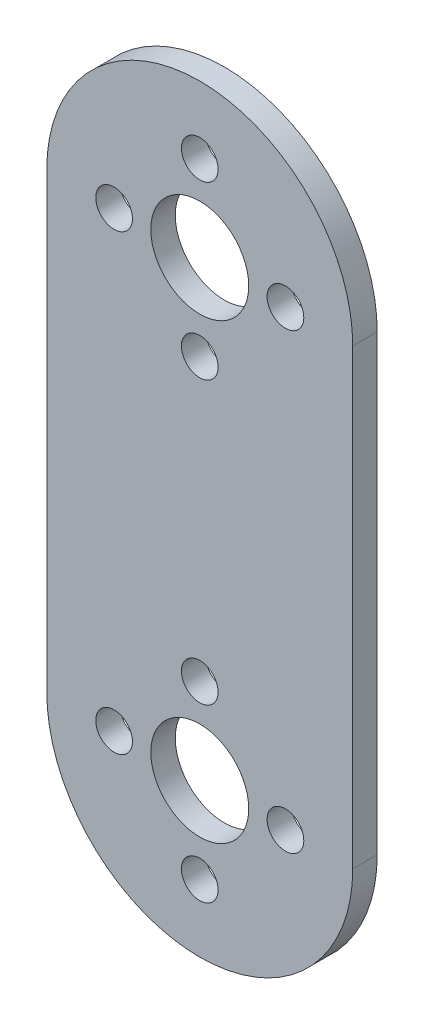
ISO-10303-21;
HEADER;
FILE_DESCRIPTION(('STEP AP214'),'2;1');
FILE_NAME('part.step','',(''),(''),'','','');
FILE_SCHEMA(('AUTOMOTIVE_DESIGN { 1 0 10303 214 1 1 1 1 }'));
ENDSEC;
DATA;
#1=APPLICATION_CONTEXT('core data for automotive mechanical design processes');
#2=APPLICATION_PROTOCOL_DEFINITION('international standard','automotive_design',2000,#1);
#3=PRODUCT_CONTEXT('',#1,'mechanical');
#4=PRODUCT('Part','Part','',(#3));
#5=PRODUCT_RELATED_PRODUCT_CATEGORY('part','',(#4));
#6=PRODUCT_DEFINITION_FORMATION('','',#4);
#7=PRODUCT_DEFINITION_CONTEXT('part definition',#1,'design');
#8=PRODUCT_DEFINITION('design','',#6,#7);
#9=PRODUCT_DEFINITION_SHAPE('','',#8);
#10=(LENGTH_UNIT() NAMED_UNIT(*) SI_UNIT(.MILLI.,.METRE.));
#11=(NAMED_UNIT(*) PLANE_ANGLE_UNIT() SI_UNIT($,.RADIAN.));
#12=(NAMED_UNIT(*) SI_UNIT($,.STERADIAN.) SOLID_ANGLE_UNIT());
#13=UNCERTAINTY_MEASURE_WITH_UNIT(LENGTH_MEASURE(1.E-05),#10,'distance_accuracy_value','');
#14=(GEOMETRIC_REPRESENTATION_CONTEXT(3) GLOBAL_UNCERTAINTY_ASSIGNED_CONTEXT((#13)) GLOBAL_UNIT_ASSIGNED_CONTEXT((#10,
#11,#12)) REPRESENTATION_CONTEXT('',''));
#15=CARTESIAN_POINT('',(0.,0.,0.));
#16=DIRECTION('',(0.,0.,1.));
#17=DIRECTION('',(1.,0.,0.));
#18=AXIS2_PLACEMENT_3D('',#15,#16,#17);
#19=CARTESIAN_POINT('',(0.,0.,1.));
#20=DIRECTION('',(0.,0.,-1.));
#21=DIRECTION('',(-1.,0.,0.));
#22=AXIS2_PLACEMENT_3D('',#19,#20,#21);
#23=CYLINDRICAL_SURFACE('',#22,12.5);
#24=CARTESIAN_POINT('',(0.,0.,-1.));
#25=DIRECTION('',(0.,0.,1.));
#26=DIRECTION('',(1.,0.,0.));
#27=AXIS2_PLACEMENT_3D('',#24,#25,#26);
#28=CIRCLE('',#27,12.5);
#29=CARTESIAN_POINT('',(-12.5,0.,-1.));
#30=VERTEX_POINT('',#29);
#31=CARTESIAN_POINT('',(12.5,0.,-1.));
#32=VERTEX_POINT('',#31);
#33=EDGE_CURVE('E110',#30,#32,#28,.T.);
#34=ORIENTED_EDGE('',*,*,#33,.T.);
#35=DIRECTION('',(0.,0.,-1.));
#36=VECTOR('',#35,1.);
#37=CARTESIAN_POINT('',(12.5,0.,1.));
#38=LINE('',#37,#36);
#39=CARTESIAN_POINT('',(12.5,0.,1.));
#40=VERTEX_POINT('',#39);
#41=EDGE_CURVE('E11',#40,#32,#38,.T.);
#42=ORIENTED_EDGE('',*,*,#41,.F.);
#43=CARTESIAN_POINT('',(0.,0.,1.));
#44=DIRECTION('',(0.,0.,1.));
#45=DIRECTION('',(1.,0.,0.));
#46=AXIS2_PLACEMENT_3D('',#43,#44,#45);
#47=CIRCLE('',#46,12.5);
#48=CARTESIAN_POINT('',(-12.5,0.,1.));
#49=VERTEX_POINT('',#48);
#50=EDGE_CURVE('E94',#49,#40,#47,.T.);
#51=ORIENTED_EDGE('',*,*,#50,.F.);
#52=DIRECTION('',(0.,0.,-1.));
#53=VECTOR('',#52,1.);
#54=CARTESIAN_POINT('',(-12.5,0.,1.));
#55=LINE('',#54,#53);
#56=EDGE_CURVE('E106',#49,#30,#55,.T.);
#57=ORIENTED_EDGE('',*,*,#56,.T.);
#58=EDGE_LOOP('',(#34,#42,#51,#57));
#59=FACE_BOUND('',#58,.T.);
#60=ADVANCED_FACE('F42',(#59),#23,.T.);
#61=CARTESIAN_POINT('',(12.5,0.,1.));
#62=DIRECTION('',(-1.,0.,0.));
#63=DIRECTION('',(0.,0.,1.));
#64=AXIS2_PLACEMENT_3D('',#61,#62,#63);
#65=PLANE('',#64);
#66=DIRECTION('',(0.,1.,0.));
#67=VECTOR('',#66,1.);
#68=CARTESIAN_POINT('',(12.5,0.,-1.));
#69=LINE('',#68,#67);
#70=CARTESIAN_POINT('',(12.5,37.,-1.));
#71=VERTEX_POINT('',#70);
#72=EDGE_CURVE('E99',#32,#71,#69,.T.);
#73=ORIENTED_EDGE('',*,*,#72,.T.);
#74=DIRECTION('',(0.,0.,-1.));
#75=VECTOR('',#74,1.);
#76=CARTESIAN_POINT('',(12.5,37.,1.));
#77=LINE('',#76,#75);
#78=CARTESIAN_POINT('',(12.5,37.,1.));
#79=VERTEX_POINT('',#78);
#80=EDGE_CURVE('E51',#79,#71,#77,.T.);
#81=ORIENTED_EDGE('',*,*,#80,.F.);
#82=DIRECTION('',(0.,1.,0.));
#83=VECTOR('',#82,1.);
#84=CARTESIAN_POINT('',(12.5,0.,1.));
#85=LINE('',#84,#83);
#86=EDGE_CURVE('E89',#40,#79,#85,.T.);
#87=ORIENTED_EDGE('',*,*,#86,.F.);
#88=ORIENTED_EDGE('',*,*,#41,.T.);
#89=EDGE_LOOP('',(#73,#81,#87,#88));
#90=FACE_BOUND('',#89,.T.);
#91=ADVANCED_FACE('F98',(#90),#65,.F.);
#92=CARTESIAN_POINT('',(0.,37.,1.));
#93=DIRECTION('',(0.,0.,-1.));
#94=DIRECTION('',(-1.,0.,0.));
#95=AXIS2_PLACEMENT_3D('',#92,#93,#94);
#96=CYLINDRICAL_SURFACE('',#95,12.5);
#97=CARTESIAN_POINT('',(0.,37.,-1.));
#98=DIRECTION('',(0.,0.,1.));
#99=DIRECTION('',(1.,0.,0.));
#100=AXIS2_PLACEMENT_3D('',#97,#98,#99);
#101=CIRCLE('',#100,12.5);
#102=CARTESIAN_POINT('',(-12.5,37.,-1.));
#103=VERTEX_POINT('',#102);
#104=EDGE_CURVE('E76',#71,#103,#101,.T.);
#105=ORIENTED_EDGE('',*,*,#104,.T.);
#106=DIRECTION('',(0.,0.,-1.));
#107=VECTOR('',#106,1.);
#108=CARTESIAN_POINT('',(-12.5,37.,1.));
#109=LINE('',#108,#107);
#110=CARTESIAN_POINT('',(-12.5,37.,1.));
#111=VERTEX_POINT('',#110);
#112=EDGE_CURVE('E101',#111,#103,#109,.T.);
#113=ORIENTED_EDGE('',*,*,#112,.F.);
#114=CARTESIAN_POINT('',(0.,37.,1.));
#115=DIRECTION('',(0.,0.,1.));
#116=DIRECTION('',(1.,0.,0.));
#117=AXIS2_PLACEMENT_3D('',#114,#115,#116);
#118=CIRCLE('',#117,12.5);
#119=EDGE_CURVE('E92',#79,#111,#118,.T.);
#120=ORIENTED_EDGE('',*,*,#119,.F.);
#121=ORIENTED_EDGE('',*,*,#80,.T.);
#122=EDGE_LOOP('',(#105,#113,#120,#121));
#123=FACE_BOUND('',#122,.T.);
#124=ADVANCED_FACE('F102',(#123),#96,.T.);
#125=CARTESIAN_POINT('',(-12.5,0.,1.));
#126=DIRECTION('',(1.,0.,0.));
#127=DIRECTION('',(0.,0.,-1.));
#128=AXIS2_PLACEMENT_3D('',#125,#126,#127);
#129=PLANE('',#128);
#130=DIRECTION('',(0.,-1.,0.));
#131=VECTOR('',#130,1.);
#132=CARTESIAN_POINT('',(-12.5,0.,-1.));
#133=LINE('',#132,#131);
#134=EDGE_CURVE('E82',#103,#30,#133,.T.);
#135=ORIENTED_EDGE('',*,*,#134,.T.);
#136=ORIENTED_EDGE('',*,*,#56,.F.);
#137=DIRECTION('',(0.,-1.,0.));
#138=VECTOR('',#137,1.);
#139=CARTESIAN_POINT('',(-12.5,0.,1.));
#140=LINE('',#139,#138);
#141=EDGE_CURVE('E59',#111,#49,#140,.T.);
#142=ORIENTED_EDGE('',*,*,#141,.F.);
#143=ORIENTED_EDGE('',*,*,#112,.T.);
#144=EDGE_LOOP('',(#135,#136,#142,#143));
#145=FACE_BOUND('',#144,.T.);
#146=ADVANCED_FACE('F124',(#145),#129,.F.);
#147=CARTESIAN_POINT('',(0.,0.,1.));
#148=DIRECTION('',(0.,0.,1.));
#149=DIRECTION('',(1.,0.,0.));
#150=AXIS2_PLACEMENT_3D('',#147,#148,#149);
#151=PLANE('',#150);
#152=CARTESIAN_POINT('',(7.,0.,1.));
#153=DIRECTION('',(0.,0.,1.));
#154=DIRECTION('',(1.,0.,0.));
#155=AXIS2_PLACEMENT_3D('',#152,#153,#154);
#156=CIRCLE('',#155,1.5);
#157=CARTESIAN_POINT('',(8.5,0.,1.));
#158=VERTEX_POINT('',#157);
#159=EDGE_CURVE('E186',#158,#158,#156,.T.);
#160=ORIENTED_EDGE('',*,*,#159,.F.);
#161=EDGE_LOOP('',(#160));
#162=FACE_BOUND('',#161,.T.);
#163=CARTESIAN_POINT('',(0.,7.,1.));
#164=DIRECTION('',(0.,0.,1.));
#165=DIRECTION('',(1.,0.,0.));
#166=AXIS2_PLACEMENT_3D('',#163,#164,#165);
#167=CIRCLE('',#166,1.5);
#168=CARTESIAN_POINT('',(1.5,7.,1.));
#169=VERTEX_POINT('',#168);
#170=EDGE_CURVE('E196',#169,#169,#167,.T.);
#171=ORIENTED_EDGE('',*,*,#170,.F.);
#172=EDGE_LOOP('',(#171));
#173=FACE_BOUND('',#172,.T.);
#174=CARTESIAN_POINT('',(-7.,0.,1.));
#175=DIRECTION('',(0.,0.,1.));
#176=DIRECTION('',(1.,0.,0.));
#177=AXIS2_PLACEMENT_3D('',#174,#175,#176);
#178=CIRCLE('',#177,1.5);
#179=CARTESIAN_POINT('',(-5.5,0.,1.));
#180=VERTEX_POINT('',#179);
#181=EDGE_CURVE('E187',#180,#180,#178,.T.);
#182=ORIENTED_EDGE('',*,*,#181,.F.);
#183=EDGE_LOOP('',(#182));
#184=FACE_BOUND('',#183,.T.);
#185=CARTESIAN_POINT('',(0.,-7.,1.));
#186=DIRECTION('',(0.,0.,1.));
#187=DIRECTION('',(1.,0.,0.));
#188=AXIS2_PLACEMENT_3D('',#185,#186,#187);
#189=CIRCLE('',#188,1.5);
#190=CARTESIAN_POINT('',(1.5,-7.,1.));
#191=VERTEX_POINT('',#190);
#192=EDGE_CURVE('E178',#191,#191,#189,.T.);
#193=ORIENTED_EDGE('',*,*,#192,.F.);
#194=EDGE_LOOP('',(#193));
#195=FACE_BOUND('',#194,.T.);
#196=CARTESIAN_POINT('',(0.,0.,1.));
#197=DIRECTION('',(0.,0.,1.));
#198=DIRECTION('',(1.,0.,0.));
#199=AXIS2_PLACEMENT_3D('',#196,#197,#198);
#200=CIRCLE('',#199,4.);
#201=CARTESIAN_POINT('',(4.,0.,1.));
#202=VERTEX_POINT('',#201);
#203=EDGE_CURVE('E152',#202,#202,#200,.T.);
#204=ORIENTED_EDGE('',*,*,#203,.F.);
#205=EDGE_LOOP('',(#204));
#206=FACE_BOUND('',#205,.T.);
#207=CARTESIAN_POINT('',(7.,37.,1.));
#208=DIRECTION('',(0.,0.,1.));
#209=DIRECTION('',(1.,0.,0.));
#210=AXIS2_PLACEMENT_3D('',#207,#208,#209);
#211=CIRCLE('',#210,1.5);
#212=CARTESIAN_POINT('',(8.5,37.,1.));
#213=VERTEX_POINT('',#212);
#214=EDGE_CURVE('E164',#213,#213,#211,.F.);
#215=ORIENTED_EDGE('',*,*,#214,.T.);
#216=EDGE_LOOP('',(#215));
#217=FACE_BOUND('',#216,.T.);
#218=CARTESIAN_POINT('',(0.,30.,1.));
#219=DIRECTION('',(0.,0.,1.));
#220=DIRECTION('',(1.,0.,0.));
#221=AXIS2_PLACEMENT_3D('',#218,#219,#220);
#222=CIRCLE('',#221,1.5);
#223=CARTESIAN_POINT('',(1.5,30.,1.));
#224=VERTEX_POINT('',#223);
#225=EDGE_CURVE('E156',#224,#224,#222,.F.);
#226=ORIENTED_EDGE('',*,*,#225,.T.);
#227=EDGE_LOOP('',(#226));
#228=FACE_BOUND('',#227,.T.);
#229=CARTESIAN_POINT('',(-7.,37.0000000000001,1.));
#230=DIRECTION('',(0.,0.,1.));
#231=DIRECTION('',(1.,0.,0.));
#232=AXIS2_PLACEMENT_3D('',#229,#230,#231);
#233=CIRCLE('',#232,1.5);
#234=CARTESIAN_POINT('',(-5.5,37.0000000000001,1.));
#235=VERTEX_POINT('',#234);
#236=EDGE_CURVE('E147',#235,#235,#233,.F.);
#237=ORIENTED_EDGE('',*,*,#236,.T.);
#238=EDGE_LOOP('',(#237));
#239=FACE_BOUND('',#238,.T.);
#240=CARTESIAN_POINT('',(0.,44.,1.));
#241=DIRECTION('',(0.,0.,1.));
#242=DIRECTION('',(1.,0.,0.));
#243=AXIS2_PLACEMENT_3D('',#240,#241,#242);
#244=CIRCLE('',#243,1.5);
#245=CARTESIAN_POINT('',(1.5,44.,1.));
#246=VERTEX_POINT('',#245);
#247=EDGE_CURVE('E139',#246,#246,#244,.F.);
#248=ORIENTED_EDGE('',*,*,#247,.T.);
#249=EDGE_LOOP('',(#248));
#250=FACE_BOUND('',#249,.T.);
#251=CARTESIAN_POINT('',(0.,37.,1.));
#252=DIRECTION('',(0.,0.,1.));
#253=DIRECTION('',(1.,0.,0.));
#254=AXIS2_PLACEMENT_3D('',#251,#252,#253);
#255=CIRCLE('',#254,4.);
#256=CARTESIAN_POINT('',(4.,37.,1.));
#257=VERTEX_POINT('',#256);
#258=EDGE_CURVE('E131',#257,#257,#255,.F.);
#259=ORIENTED_EDGE('',*,*,#258,.T.);
#260=EDGE_LOOP('',(#259));
#261=FACE_BOUND('',#260,.T.);
#262=ORIENTED_EDGE('',*,*,#50,.T.);
#263=ORIENTED_EDGE('',*,*,#86,.T.);
#264=ORIENTED_EDGE('',*,*,#119,.T.);
#265=ORIENTED_EDGE('',*,*,#141,.T.);
#266=EDGE_LOOP('',(#262,#263,#264,#265));
#267=FACE_BOUND('',#266,.T.);
#268=ADVANCED_FACE('F90',(#162,#173,#184,#195,#206,#217,#228,#239,#250,#261,#267),#151,.T.);
#269=CARTESIAN_POINT('',(0.,0.,-1.));
#270=DIRECTION('',(0.,0.,1.));
#271=DIRECTION('',(1.,0.,0.));
#272=AXIS2_PLACEMENT_3D('',#269,#270,#271);
#273=PLANE('',#272);
#274=CARTESIAN_POINT('',(7.,0.,-1.));
#275=DIRECTION('',(0.,0.,1.));
#276=DIRECTION('',(0.,-1.,0.));
#277=AXIS2_PLACEMENT_3D('',#274,#275,#276);
#278=CIRCLE('',#277,1.5);
#279=CARTESIAN_POINT('',(7.,-1.49999999999998,-1.));
#280=VERTEX_POINT('',#279);
#281=EDGE_CURVE('E200',#280,#280,#278,.T.);
#282=ORIENTED_EDGE('',*,*,#281,.T.);
#283=EDGE_LOOP('',(#282));
#284=FACE_BOUND('',#283,.T.);
#285=CARTESIAN_POINT('',(0.,7.,-1.));
#286=DIRECTION('',(0.,0.,1.));
#287=DIRECTION('',(1.,0.,0.));
#288=AXIS2_PLACEMENT_3D('',#285,#286,#287);
#289=CIRCLE('',#288,1.5);
#290=CARTESIAN_POINT('',(1.5,7.,-1.));
#291=VERTEX_POINT('',#290);
#292=EDGE_CURVE('E191',#291,#291,#289,.T.);
#293=ORIENTED_EDGE('',*,*,#292,.T.);
#294=EDGE_LOOP('',(#293));
#295=FACE_BOUND('',#294,.T.);
#296=CARTESIAN_POINT('',(-7.,0.,-1.));
#297=DIRECTION('',(0.,0.,1.));
#298=DIRECTION('',(0.,1.,0.));
#299=AXIS2_PLACEMENT_3D('',#296,#297,#298);
#300=CIRCLE('',#299,1.5);
#301=CARTESIAN_POINT('',(-7.00000000000002,1.49999999999993,-1.));
#302=VERTEX_POINT('',#301);
#303=EDGE_CURVE('E192',#302,#302,#300,.T.);
#304=ORIENTED_EDGE('',*,*,#303,.T.);
#305=EDGE_LOOP('',(#304));
#306=FACE_BOUND('',#305,.T.);
#307=CARTESIAN_POINT('',(0.,-7.,-1.));
#308=DIRECTION('',(0.,0.,1.));
#309=DIRECTION('',(-1.,0.,0.));
#310=AXIS2_PLACEMENT_3D('',#307,#308,#309);
#311=CIRCLE('',#310,1.5);
#312=CARTESIAN_POINT('',(-1.5,-7.,-1.));
#313=VERTEX_POINT('',#312);
#314=EDGE_CURVE('E182',#313,#313,#311,.T.);
#315=ORIENTED_EDGE('',*,*,#314,.T.);
#316=EDGE_LOOP('',(#315));
#317=FACE_BOUND('',#316,.T.);
#318=CARTESIAN_POINT('',(0.,0.,-1.));
#319=DIRECTION('',(0.,0.,1.));
#320=DIRECTION('',(-1.,0.,0.));
#321=AXIS2_PLACEMENT_3D('',#318,#319,#320);
#322=CIRCLE('',#321,4.);
#323=CARTESIAN_POINT('',(-4.,0.,-1.));
#324=VERTEX_POINT('',#323);
#325=EDGE_CURVE('E174',#324,#324,#322,.T.);
#326=ORIENTED_EDGE('',*,*,#325,.T.);
#327=EDGE_LOOP('',(#326));
#328=FACE_BOUND('',#327,.T.);
#329=CARTESIAN_POINT('',(7.,37.,-1.));
#330=DIRECTION('',(0.,0.,-1.));
#331=DIRECTION('',(0.,1.,0.));
#332=AXIS2_PLACEMENT_3D('',#329,#330,#331);
#333=CIRCLE('',#332,1.5);
#334=CARTESIAN_POINT('',(7.,38.5,-1.));
#335=VERTEX_POINT('',#334);
#336=EDGE_CURVE('E143',#335,#335,#333,.T.);
#337=ORIENTED_EDGE('',*,*,#336,.F.);
#338=EDGE_LOOP('',(#337));
#339=FACE_BOUND('',#338,.T.);
#340=CARTESIAN_POINT('',(0.,30.,-1.));
#341=DIRECTION('',(0.,0.,-1.));
#342=DIRECTION('',(1.,0.,0.));
#343=AXIS2_PLACEMENT_3D('',#340,#341,#342);
#344=CIRCLE('',#343,1.5);
#345=CARTESIAN_POINT('',(1.5,30.,-1.));
#346=VERTEX_POINT('',#345);
#347=EDGE_CURVE('E160',#346,#346,#344,.T.);
#348=ORIENTED_EDGE('',*,*,#347,.F.);
#349=EDGE_LOOP('',(#348));
#350=FACE_BOUND('',#349,.T.);
#351=CARTESIAN_POINT('',(-7.,37.0000000000001,-1.));
#352=DIRECTION('',(0.,0.,-1.));
#353=DIRECTION('',(0.,-1.,0.));
#354=AXIS2_PLACEMENT_3D('',#351,#352,#353);
#355=CIRCLE('',#354,1.5);
#356=CARTESIAN_POINT('',(-7.00000000000002,35.5000000000001,-1.));
#357=VERTEX_POINT('',#356);
#358=EDGE_CURVE('E151',#357,#357,#355,.T.);
#359=ORIENTED_EDGE('',*,*,#358,.F.);
#360=EDGE_LOOP('',(#359));
#361=FACE_BOUND('',#360,.T.);
#362=CARTESIAN_POINT('',(0.,44.,-1.));
#363=DIRECTION('',(0.,0.,-1.));
#364=DIRECTION('',(-1.,0.,0.));
#365=AXIS2_PLACEMENT_3D('',#362,#363,#364);
#366=CIRCLE('',#365,1.5);
#367=CARTESIAN_POINT('',(-1.5,44.,-1.));
#368=VERTEX_POINT('',#367);
#369=EDGE_CURVE('E135',#368,#368,#366,.T.);
#370=ORIENTED_EDGE('',*,*,#369,.F.);
#371=EDGE_LOOP('',(#370));
#372=FACE_BOUND('',#371,.T.);
#373=CARTESIAN_POINT('',(0.,37.,-1.));
#374=DIRECTION('',(0.,0.,-1.));
#375=DIRECTION('',(-1.,0.,0.));
#376=AXIS2_PLACEMENT_3D('',#373,#374,#375);
#377=CIRCLE('',#376,4.);
#378=CARTESIAN_POINT('',(-4.,37.,-1.));
#379=VERTEX_POINT('',#378);
#380=EDGE_CURVE('E114',#379,#379,#377,.T.);
#381=ORIENTED_EDGE('',*,*,#380,.F.);
#382=EDGE_LOOP('',(#381));
#383=FACE_BOUND('',#382,.T.);
#384=ORIENTED_EDGE('',*,*,#33,.F.);
#385=ORIENTED_EDGE('',*,*,#134,.F.);
#386=ORIENTED_EDGE('',*,*,#104,.F.);
#387=ORIENTED_EDGE('',*,*,#72,.F.);
#388=EDGE_LOOP('',(#384,#385,#386,#387));
#389=FACE_BOUND('',#388,.T.);
#390=ADVANCED_FACE('F127',(#284,#295,#306,#317,#328,#339,#350,#361,#372,#383,#389),#273,.F.);
#391=CARTESIAN_POINT('',(0.,37.,1.001));
#392=DIRECTION('',(0.,0.,-1.));
#393=DIRECTION('',(-1.,0.,0.));
#394=AXIS2_PLACEMENT_3D('',#391,#392,#393);
#395=CYLINDRICAL_SURFACE('',#394,4.);
#396=ORIENTED_EDGE('',*,*,#258,.F.);
#397=EDGE_LOOP('',(#396));
#398=FACE_BOUND('',#397,.T.);
#399=ORIENTED_EDGE('',*,*,#380,.T.);
#400=EDGE_LOOP('',(#399));
#401=FACE_BOUND('',#400,.T.);
#402=ADVANCED_FACE('F237',(#398,#401),#395,.F.);
#403=CARTESIAN_POINT('',(0.,44.,1.001));
#404=DIRECTION('',(0.,0.,-1.));
#405=DIRECTION('',(-1.,0.,0.));
#406=AXIS2_PLACEMENT_3D('',#403,#404,#405);
#407=CYLINDRICAL_SURFACE('',#406,1.5);
#408=ORIENTED_EDGE('',*,*,#247,.F.);
#409=EDGE_LOOP('',(#408));
#410=FACE_BOUND('',#409,.T.);
#411=ORIENTED_EDGE('',*,*,#369,.T.);
#412=EDGE_LOOP('',(#411));
#413=FACE_BOUND('',#412,.T.);
#414=ADVANCED_FACE('F243',(#410,#413),#407,.F.);
#415=CARTESIAN_POINT('',(-7.,37.0000000000001,1.001));
#416=DIRECTION('',(0.,0.,-1.));
#417=DIRECTION('',(-1.,0.,0.));
#418=AXIS2_PLACEMENT_3D('',#415,#416,#417);
#419=CYLINDRICAL_SURFACE('',#418,1.5);
#420=ORIENTED_EDGE('',*,*,#236,.F.);
#421=EDGE_LOOP('',(#420));
#422=FACE_BOUND('',#421,.T.);
#423=ORIENTED_EDGE('',*,*,#358,.T.);
#424=EDGE_LOOP('',(#423));
#425=FACE_BOUND('',#424,.T.);
#426=ADVANCED_FACE('F247',(#422,#425),#419,.F.);
#427=CARTESIAN_POINT('',(0.,30.,1.001));
#428=DIRECTION('',(0.,0.,-1.));
#429=DIRECTION('',(-1.,0.,0.));
#430=AXIS2_PLACEMENT_3D('',#427,#428,#429);
#431=CYLINDRICAL_SURFACE('',#430,1.5);
#432=ORIENTED_EDGE('',*,*,#225,.F.);
#433=EDGE_LOOP('',(#432));
#434=FACE_BOUND('',#433,.T.);
#435=ORIENTED_EDGE('',*,*,#347,.T.);
#436=EDGE_LOOP('',(#435));
#437=FACE_BOUND('',#436,.T.);
#438=ADVANCED_FACE('F251',(#434,#437),#431,.F.);
#439=CARTESIAN_POINT('',(7.,37.,1.001));
#440=DIRECTION('',(0.,0.,-1.));
#441=DIRECTION('',(-1.,0.,0.));
#442=AXIS2_PLACEMENT_3D('',#439,#440,#441);
#443=CYLINDRICAL_SURFACE('',#442,1.5);
#444=ORIENTED_EDGE('',*,*,#214,.F.);
#445=EDGE_LOOP('',(#444));
#446=FACE_BOUND('',#445,.T.);
#447=ORIENTED_EDGE('',*,*,#336,.T.);
#448=EDGE_LOOP('',(#447));
#449=FACE_BOUND('',#448,.T.);
#450=ADVANCED_FACE('F255',(#446,#449),#443,.F.);
#451=CARTESIAN_POINT('',(0.,0.,1.001));
#452=DIRECTION('',(0.,0.,-1.));
#453=DIRECTION('',(-1.,0.,0.));
#454=AXIS2_PLACEMENT_3D('',#451,#452,#453);
#455=CYLINDRICAL_SURFACE('',#454,4.);
#456=ORIENTED_EDGE('',*,*,#203,.T.);
#457=EDGE_LOOP('',(#456));
#458=FACE_BOUND('',#457,.T.);
#459=ORIENTED_EDGE('',*,*,#325,.F.);
#460=EDGE_LOOP('',(#459));
#461=FACE_BOUND('',#460,.T.);
#462=ADVANCED_FACE('F259',(#458,#461),#455,.F.);
#463=CARTESIAN_POINT('',(0.,-7.,1.001));
#464=DIRECTION('',(0.,0.,-1.));
#465=DIRECTION('',(-1.,0.,0.));
#466=AXIS2_PLACEMENT_3D('',#463,#464,#465);
#467=CYLINDRICAL_SURFACE('',#466,1.5);
#468=ORIENTED_EDGE('',*,*,#192,.T.);
#469=EDGE_LOOP('',(#468));
#470=FACE_BOUND('',#469,.T.);
#471=ORIENTED_EDGE('',*,*,#314,.F.);
#472=EDGE_LOOP('',(#471));
#473=FACE_BOUND('',#472,.T.);
#474=ADVANCED_FACE('F263',(#470,#473),#467,.F.);
#475=CARTESIAN_POINT('',(-7.,0.,1.001));
#476=DIRECTION('',(0.,0.,-1.));
#477=DIRECTION('',(-1.,0.,0.));
#478=AXIS2_PLACEMENT_3D('',#475,#476,#477);
#479=CYLINDRICAL_SURFACE('',#478,1.5);
#480=ORIENTED_EDGE('',*,*,#181,.T.);
#481=EDGE_LOOP('',(#480));
#482=FACE_BOUND('',#481,.T.);
#483=ORIENTED_EDGE('',*,*,#303,.F.);
#484=EDGE_LOOP('',(#483));
#485=FACE_BOUND('',#484,.T.);
#486=ADVANCED_FACE('F221',(#482,#485),#479,.F.);
#487=CARTESIAN_POINT('',(0.,7.,1.001));
#488=DIRECTION('',(0.,0.,-1.));
#489=DIRECTION('',(-1.,0.,0.));
#490=AXIS2_PLACEMENT_3D('',#487,#488,#489);
#491=CYLINDRICAL_SURFACE('',#490,1.5);
#492=ORIENTED_EDGE('',*,*,#170,.T.);
#493=EDGE_LOOP('',(#492));
#494=FACE_BOUND('',#493,.T.);
#495=ORIENTED_EDGE('',*,*,#292,.F.);
#496=EDGE_LOOP('',(#495));
#497=FACE_BOUND('',#496,.T.);
#498=ADVANCED_FACE('F215',(#494,#497),#491,.F.);
#499=CARTESIAN_POINT('',(7.,0.,1.001));
#500=DIRECTION('',(0.,0.,-1.));
#501=DIRECTION('',(-1.,0.,0.));
#502=AXIS2_PLACEMENT_3D('',#499,#500,#501);
#503=CYLINDRICAL_SURFACE('',#502,1.5);
#504=ORIENTED_EDGE('',*,*,#159,.T.);
#505=EDGE_LOOP('',(#504));
#506=FACE_BOUND('',#505,.T.);
#507=ORIENTED_EDGE('',*,*,#281,.F.);
#508=EDGE_LOOP('',(#507));
#509=FACE_BOUND('',#508,.T.);
#510=ADVANCED_FACE('F213',(#506,#509),#503,.F.);
#511=CLOSED_SHELL('',(#60,#91,#124,#146,#268,#390,#402,#414,#426,#438,#450,#462,#474,#486,#498,#510));
#512=MANIFOLD_SOLID_BREP('B2',#511);
#513=ADVANCED_BREP_SHAPE_REPRESENTATION('',(#18,#512),#14);
#514=SHAPE_DEFINITION_REPRESENTATION(#9,#513);
ENDSEC;
END-ISO-10303-21;
